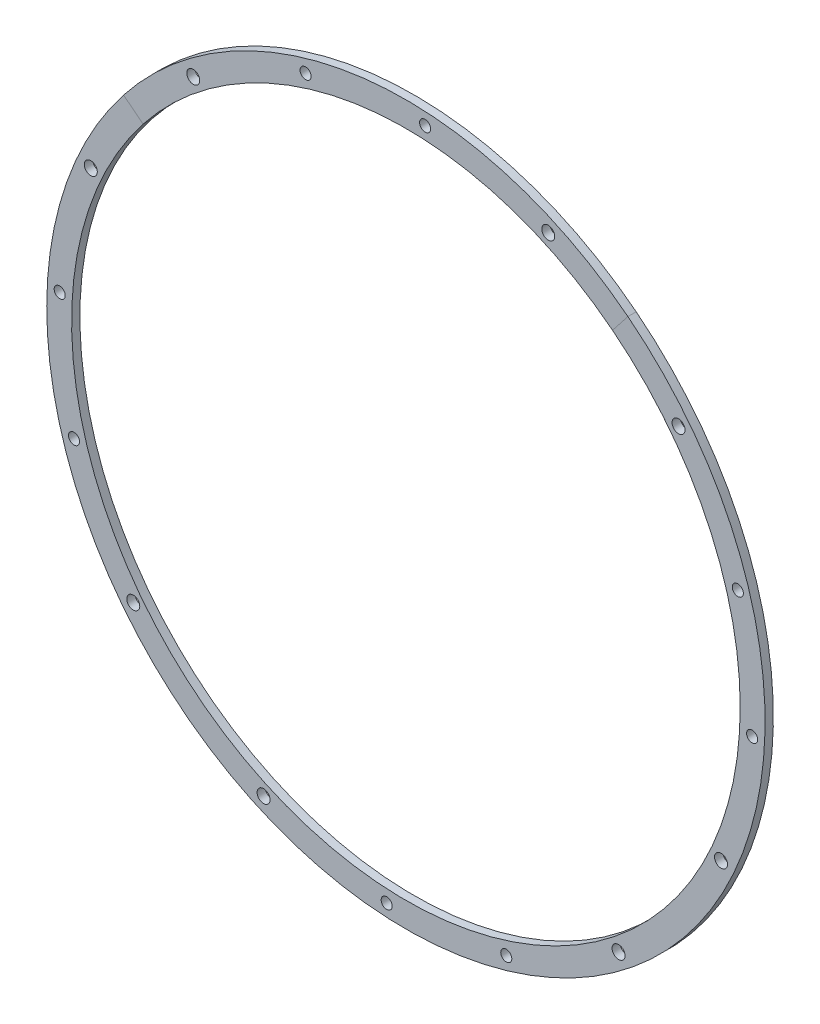
ISO-10303-21;
HEADER;
FILE_DESCRIPTION(('STEP AP214'),'2;1');
FILE_NAME('part.step','',(''),(''),'','','');
FILE_SCHEMA(('AUTOMOTIVE_DESIGN { 1 0 10303 214 1 1 1 1 }'));
ENDSEC;
DATA;
#1=APPLICATION_CONTEXT('core data for automotive mechanical design processes');
#2=APPLICATION_PROTOCOL_DEFINITION('international standard','automotive_design',2000,#1);
#3=PRODUCT_CONTEXT('',#1,'mechanical');
#4=PRODUCT('Part','Part','',(#3));
#5=PRODUCT_RELATED_PRODUCT_CATEGORY('part','',(#4));
#6=PRODUCT_DEFINITION_FORMATION('','',#4);
#7=PRODUCT_DEFINITION_CONTEXT('part definition',#1,'design');
#8=PRODUCT_DEFINITION('design','',#6,#7);
#9=PRODUCT_DEFINITION_SHAPE('','',#8);
#10=(LENGTH_UNIT() NAMED_UNIT(*) SI_UNIT(.MILLI.,.METRE.));
#11=(NAMED_UNIT(*) PLANE_ANGLE_UNIT() SI_UNIT($,.RADIAN.));
#12=(NAMED_UNIT(*) SI_UNIT($,.STERADIAN.) SOLID_ANGLE_UNIT());
#13=UNCERTAINTY_MEASURE_WITH_UNIT(LENGTH_MEASURE(1.E-05),#10,'distance_accuracy_value','');
#14=(GEOMETRIC_REPRESENTATION_CONTEXT(3) GLOBAL_UNCERTAINTY_ASSIGNED_CONTEXT((#13)) GLOBAL_UNIT_ASSIGNED_CONTEXT((#10,
#11,#12)) REPRESENTATION_CONTEXT('',''));
#15=CARTESIAN_POINT('',(0.,0.,0.));
#16=DIRECTION('',(0.,0.,1.));
#17=DIRECTION('',(1.,0.,0.));
#18=AXIS2_PLACEMENT_3D('',#15,#16,#17);
#19=CARTESIAN_POINT('',(-6.95654324842091,-125.307048908004,-7.));
#20=DIRECTION('',(0.,0.,1.));
#21=DIRECTION('',(1.,0.,0.));
#22=AXIS2_PLACEMENT_3D('',#19,#20,#21);
#23=CYLINDRICAL_SURFACE('',#22,2.);
#24=CARTESIAN_POINT('',(-6.95654324842091,-125.307048908004,3.));
#25=DIRECTION('',(0.,0.,1.));
#26=DIRECTION('',(1.,0.,0.));
#27=AXIS2_PLACEMENT_3D('',#24,#25,#26);
#28=CIRCLE('',#27,2.);
#29=CARTESIAN_POINT('',(-4.95654324842091,-125.307048908004,3.));
#30=VERTEX_POINT('',#29);
#31=EDGE_CURVE('E60',#30,#30,#28,.T.);
#32=ORIENTED_EDGE('',*,*,#31,.T.);
#33=EDGE_LOOP('',(#32));
#34=FACE_BOUND('',#33,.T.);
#35=CARTESIAN_POINT('',(-6.95654324842091,-125.307048908004,0.));
#36=DIRECTION('',(0.,0.,1.));
#37=DIRECTION('',(1.,0.,0.));
#38=AXIS2_PLACEMENT_3D('',#35,#36,#37);
#39=CIRCLE('',#38,2.);
#40=CARTESIAN_POINT('',(-4.95654324842091,-125.307048908004,0.));
#41=VERTEX_POINT('',#40);
#42=EDGE_CURVE('E146',#41,#41,#39,.T.);
#43=ORIENTED_EDGE('',*,*,#42,.F.);
#44=EDGE_LOOP('',(#43));
#45=FACE_BOUND('',#44,.T.);
#46=ADVANCED_FACE('F51',(#34,#45),#23,.F.);
#47=CARTESIAN_POINT('',(36.3205224705112,-120.129387110187,-7.));
#48=DIRECTION('',(0.,0.,1.));
#49=DIRECTION('',(1.,0.,0.));
#50=AXIS2_PLACEMENT_3D('',#47,#48,#49);
#51=CYLINDRICAL_SURFACE('',#50,2.);
#52=CARTESIAN_POINT('',(36.3205224705112,-120.129387110187,3.));
#53=DIRECTION('',(0.,0.,1.));
#54=DIRECTION('',(-1.,0.,0.));
#55=AXIS2_PLACEMENT_3D('',#52,#53,#54);
#56=CIRCLE('',#55,2.);
#57=CARTESIAN_POINT('',(34.3205224705112,-120.129387110187,3.));
#58=VERTEX_POINT('',#57);
#59=EDGE_CURVE('E12',#58,#58,#56,.T.);
#60=ORIENTED_EDGE('',*,*,#59,.T.);
#61=EDGE_LOOP('',(#60));
#62=FACE_BOUND('',#61,.T.);
#63=CARTESIAN_POINT('',(36.3205224705112,-120.129387110187,0.));
#64=DIRECTION('',(0.,0.,1.));
#65=DIRECTION('',(1.,0.,0.));
#66=AXIS2_PLACEMENT_3D('',#63,#64,#65);
#67=CIRCLE('',#66,2.);
#68=CARTESIAN_POINT('',(38.3205224705112,-120.129387110187,0.));
#69=VERTEX_POINT('',#68);
#70=EDGE_CURVE('E149',#69,#69,#67,.T.);
#71=ORIENTED_EDGE('',*,*,#70,.F.);
#72=EDGE_LOOP('',(#71));
#73=FACE_BOUND('',#72,.T.);
#74=ADVANCED_FACE('F271',(#62,#73),#51,.F.);
#75=CARTESIAN_POINT('',(76.968539476143,-98.6817811498755,3.));
#76=DIRECTION('',(0.,0.,-1.));
#77=DIRECTION('',(-1.,0.,0.));
#78=AXIS2_PLACEMENT_3D('',#75,#76,#77);
#79=CYLINDRICAL_SURFACE('',#78,2.35000000000002);
#80=CARTESIAN_POINT('',(76.968539476143,-98.6817811498755,3.));
#81=DIRECTION('',(0.,0.,1.));
#82=DIRECTION('',(1.,0.,0.));
#83=AXIS2_PLACEMENT_3D('',#80,#81,#82);
#84=CIRCLE('',#83,2.35000000000002);
#85=CARTESIAN_POINT('',(79.318539476143,-98.6817811498755,3.));
#86=VERTEX_POINT('',#85);
#87=EDGE_CURVE('E157',#86,#86,#84,.T.);
#88=ORIENTED_EDGE('',*,*,#87,.T.);
#89=EDGE_LOOP('',(#88));
#90=FACE_BOUND('',#89,.T.);
#91=CARTESIAN_POINT('',(76.968539476143,-98.6817811498755,0.));
#92=DIRECTION('',(0.,0.,1.));
#93=DIRECTION('',(1.,0.,0.));
#94=AXIS2_PLACEMENT_3D('',#91,#92,#93);
#95=CIRCLE('',#94,2.35000000000002);
#96=CARTESIAN_POINT('',(79.318539476143,-98.6817811498755,0.));
#97=VERTEX_POINT('',#96);
#98=EDGE_CURVE('E153',#97,#97,#95,.T.);
#99=ORIENTED_EDGE('',*,*,#98,.F.);
#100=EDGE_LOOP('',(#99));
#101=FACE_BOUND('',#100,.T.);
#102=ADVANCED_FACE('F231',(#90,#101),#79,.F.);
#103=CARTESIAN_POINT('',(-51.5156422585501,-114.054323033784,3.));
#104=DIRECTION('',(0.,0.,-1.));
#105=DIRECTION('',(-1.,0.,0.));
#106=AXIS2_PLACEMENT_3D('',#103,#104,#105);
#107=CYLINDRICAL_SURFACE('',#106,2.35000000000001);
#108=CARTESIAN_POINT('',(-51.5156422585501,-114.054323033784,3.));
#109=DIRECTION('',(0.,0.,1.));
#110=DIRECTION('',(1.,0.,0.));
#111=AXIS2_PLACEMENT_3D('',#108,#109,#110);
#112=CIRCLE('',#111,2.35000000000001);
#113=CARTESIAN_POINT('',(-49.1656422585501,-114.054323033784,3.));
#114=VERTEX_POINT('',#113);
#115=EDGE_CURVE('E156',#114,#114,#112,.T.);
#116=ORIENTED_EDGE('',*,*,#115,.T.);
#117=EDGE_LOOP('',(#116));
#118=FACE_BOUND('',#117,.T.);
#119=CARTESIAN_POINT('',(-51.5156422585501,-114.054323033784,0.));
#120=DIRECTION('',(0.,0.,1.));
#121=DIRECTION('',(1.,0.,0.));
#122=AXIS2_PLACEMENT_3D('',#119,#120,#121);
#123=CIRCLE('',#122,2.35000000000001);
#124=CARTESIAN_POINT('',(-49.1656422585501,-114.054323033784,0.));
#125=VERTEX_POINT('',#124);
#126=EDGE_CURVE('E150',#125,#125,#123,.T.);
#127=ORIENTED_EDGE('',*,*,#126,.F.);
#128=EDGE_LOOP('',(#127));
#129=FACE_BOUND('',#128,.T.);
#130=ADVANCED_FACE('F225',(#118,#129),#107,.F.);
#131=CARTESIAN_POINT('',(0.,0.,3.));
#132=DIRECTION('',(0.,0.,1.));
#133=DIRECTION('',(1.,0.,0.));
#134=AXIS2_PLACEMENT_3D('',#131,#132,#133);
#135=PLANE('',#134);
#136=ORIENTED_EDGE('',*,*,#115,.F.);
#137=EDGE_LOOP('',(#136));
#138=FACE_BOUND('',#137,.T.);
#139=ORIENTED_EDGE('',*,*,#87,.F.);
#140=EDGE_LOOP('',(#139));
#141=FACE_BOUND('',#140,.T.);
#142=ORIENTED_EDGE('',*,*,#59,.F.);
#143=EDGE_LOOP('',(#142));
#144=FACE_BOUND('',#143,.T.);
#145=ORIENTED_EDGE('',*,*,#31,.F.);
#146=EDGE_LOOP('',(#145));
#147=FACE_BOUND('',#146,.T.);
#148=CARTESIAN_POINT('',(0.,0.,3.));
#149=DIRECTION('',(0.,0.,1.));
#150=DIRECTION('',(1.,0.,0.));
#151=AXIS2_PLACEMENT_3D('',#148,#149,#150);
#152=CIRCLE('',#151,121.);
#153=CARTESIAN_POINT('',(-95.1179707961619,74.7901840592767,3.));
#154=VERTEX_POINT('',#153);
#155=CARTESIAN_POINT('',(74.7901840592768,95.1179707961618,3.));
#156=VERTEX_POINT('',#155);
#157=EDGE_CURVE('E168',#154,#156,#152,.T.);
#158=ORIENTED_EDGE('',*,*,#157,.F.);
#159=DIRECTION('',(0.786098932199685,-0.618100694704767,0.));
#160=VECTOR('',#159,1.);
#161=CARTESIAN_POINT('',(0.,0.,3.));
#162=LINE('',#161,#160);
#163=CARTESIAN_POINT('',(-102.192861185959,80.3530903116197,3.));
#164=VERTEX_POINT('',#163);
#165=EDGE_CURVE('E99',#164,#154,#162,.T.);
#166=ORIENTED_EDGE('',*,*,#165,.F.);
#167=CARTESIAN_POINT('',(0.,0.,3.));
#168=DIRECTION('',(0.,0.,1.));
#169=DIRECTION('',(1.,0.,0.));
#170=AXIS2_PLACEMENT_3D('',#167,#168,#169);
#171=CIRCLE('',#170,130.);
#172=CARTESIAN_POINT('',(80.3530903116197,102.192861185959,3.));
#173=VERTEX_POINT('',#172);
#174=EDGE_CURVE('E55',#164,#173,#171,.T.);
#175=ORIENTED_EDGE('',*,*,#174,.T.);
#176=DIRECTION('',(-0.618100694704767,-0.786098932199685,0.));
#177=VECTOR('',#176,1.);
#178=CARTESIAN_POINT('',(0.,0.,3.));
#179=LINE('',#178,#177);
#180=EDGE_CURVE('E97',#173,#156,#179,.T.);
#181=ORIENTED_EDGE('',*,*,#180,.T.);
#182=EDGE_LOOP('',(#158,#166,#175,#181));
#183=FACE_BOUND('',#182,.T.);
#184=CARTESIAN_POINT('',(-125.307048908004,6.9565432484209,3.));
#185=DIRECTION('',(0.,0.,1.));
#186=DIRECTION('',(1.,0.,0.));
#187=AXIS2_PLACEMENT_3D('',#184,#185,#186);
#188=CIRCLE('',#187,2.);
#189=CARTESIAN_POINT('',(-123.307048908004,6.9565432484209,3.));
#190=VERTEX_POINT('',#189);
#191=EDGE_CURVE('E121',#190,#190,#188,.T.);
#192=ORIENTED_EDGE('',*,*,#191,.F.);
#193=EDGE_LOOP('',(#192));
#194=FACE_BOUND('',#193,.T.);
#195=CARTESIAN_POINT('',(-120.129387110187,-36.3205224705112,3.));
#196=DIRECTION('',(0.,0.,1.));
#197=DIRECTION('',(-1.,0.,0.));
#198=AXIS2_PLACEMENT_3D('',#195,#196,#197);
#199=CIRCLE('',#198,2.);
#200=CARTESIAN_POINT('',(-122.129387110187,-36.3205224705112,3.));
#201=VERTEX_POINT('',#200);
#202=EDGE_CURVE('E100',#201,#201,#199,.T.);
#203=ORIENTED_EDGE('',*,*,#202,.F.);
#204=EDGE_LOOP('',(#203));
#205=FACE_BOUND('',#204,.T.);
#206=CARTESIAN_POINT('',(-98.6817811498755,-76.968539476143,3.));
#207=DIRECTION('',(0.,0.,1.));
#208=DIRECTION('',(1.,0.,0.));
#209=AXIS2_PLACEMENT_3D('',#206,#207,#208);
#210=CIRCLE('',#209,2.35);
#211=CARTESIAN_POINT('',(-96.3317811498755,-76.968539476143,3.));
#212=VERTEX_POINT('',#211);
#213=EDGE_CURVE('E126',#212,#212,#210,.T.);
#214=ORIENTED_EDGE('',*,*,#213,.F.);
#215=EDGE_LOOP('',(#214));
#216=FACE_BOUND('',#215,.T.);
#217=CARTESIAN_POINT('',(-114.054323033784,51.5156422585501,3.));
#218=DIRECTION('',(0.,0.,1.));
#219=DIRECTION('',(1.,0.,0.));
#220=AXIS2_PLACEMENT_3D('',#217,#218,#219);
#221=CIRCLE('',#220,2.35);
#222=CARTESIAN_POINT('',(-111.704323033784,51.5156422585501,3.));
#223=VERTEX_POINT('',#222);
#224=EDGE_CURVE('E125',#223,#223,#221,.T.);
#225=ORIENTED_EDGE('',*,*,#224,.F.);
#226=EDGE_LOOP('',(#225));
#227=FACE_BOUND('',#226,.T.);
#228=CARTESIAN_POINT('',(114.054323033784,-51.5156422585501,3.));
#229=DIRECTION('',(0.,0.,1.));
#230=DIRECTION('',(1.,0.,0.));
#231=AXIS2_PLACEMENT_3D('',#228,#229,#230);
#232=CIRCLE('',#231,2.35000000000002);
#233=CARTESIAN_POINT('',(116.404323033784,-51.5156422585501,3.));
#234=VERTEX_POINT('',#233);
#235=EDGE_CURVE('E211',#234,#234,#232,.T.);
#236=ORIENTED_EDGE('',*,*,#235,.F.);
#237=EDGE_LOOP('',(#236));
#238=FACE_BOUND('',#237,.T.);
#239=CARTESIAN_POINT('',(98.6817811498755,76.968539476143,3.));
#240=DIRECTION('',(0.,0.,1.));
#241=DIRECTION('',(1.,0.,0.));
#242=AXIS2_PLACEMENT_3D('',#239,#240,#241);
#243=CIRCLE('',#242,2.35000000000002);
#244=CARTESIAN_POINT('',(101.031781149876,76.968539476143,3.));
#245=VERTEX_POINT('',#244);
#246=EDGE_CURVE('E207',#245,#245,#243,.T.);
#247=ORIENTED_EDGE('',*,*,#246,.F.);
#248=EDGE_LOOP('',(#247));
#249=FACE_BOUND('',#248,.T.);
#250=CARTESIAN_POINT('',(125.307048908004,-6.95654324842089,3.));
#251=DIRECTION('',(0.,0.,1.));
#252=DIRECTION('',(1.,0.,0.));
#253=AXIS2_PLACEMENT_3D('',#250,#251,#252);
#254=CIRCLE('',#253,2.);
#255=CARTESIAN_POINT('',(127.307048908004,-6.95654324842089,3.));
#256=VERTEX_POINT('',#255);
#257=EDGE_CURVE('E205',#256,#256,#254,.T.);
#258=ORIENTED_EDGE('',*,*,#257,.F.);
#259=EDGE_LOOP('',(#258));
#260=FACE_BOUND('',#259,.T.);
#261=CARTESIAN_POINT('',(120.129387110187,36.3205224705112,3.));
#262=DIRECTION('',(0.,0.,1.));
#263=DIRECTION('',(-1.,0.,0.));
#264=AXIS2_PLACEMENT_3D('',#261,#262,#263);
#265=CIRCLE('',#264,2.);
#266=CARTESIAN_POINT('',(118.129387110187,36.3205224705112,3.));
#267=VERTEX_POINT('',#266);
#268=EDGE_CURVE('E145',#267,#267,#265,.T.);
#269=ORIENTED_EDGE('',*,*,#268,.F.);
#270=EDGE_LOOP('',(#269));
#271=FACE_BOUND('',#270,.T.);
#272=ADVANCED_FACE('F95',(#138,#141,#144,#147,#183,#194,#205,#216,#227,#238,#249,#260,#271),
#135,.T.);
#273=CARTESIAN_POINT('',(0.,0.,0.));
#274=DIRECTION('',(0.,0.,1.));
#275=DIRECTION('',(1.,0.,0.));
#276=AXIS2_PLACEMENT_3D('',#273,#274,#275);
#277=PLANE('',#276);
#278=ORIENTED_EDGE('',*,*,#126,.T.);
#279=EDGE_LOOP('',(#278));
#280=FACE_BOUND('',#279,.T.);
#281=ORIENTED_EDGE('',*,*,#98,.T.);
#282=EDGE_LOOP('',(#281));
#283=FACE_BOUND('',#282,.T.);
#284=ORIENTED_EDGE('',*,*,#70,.T.);
#285=EDGE_LOOP('',(#284));
#286=FACE_BOUND('',#285,.T.);
#287=ORIENTED_EDGE('',*,*,#42,.T.);
#288=EDGE_LOOP('',(#287));
#289=FACE_BOUND('',#288,.T.);
#290=CARTESIAN_POINT('',(0.,0.,0.));
#291=DIRECTION('',(0.,0.,1.));
#292=DIRECTION('',(1.,0.,0.));
#293=AXIS2_PLACEMENT_3D('',#290,#291,#292);
#294=CIRCLE('',#293,130.);
#295=CARTESIAN_POINT('',(-102.192861185959,80.3530903116197,0.));
#296=VERTEX_POINT('',#295);
#297=CARTESIAN_POINT('',(80.3530903116197,102.192861185959,0.));
#298=VERTEX_POINT('',#297);
#299=EDGE_CURVE('E75',#296,#298,#294,.T.);
#300=ORIENTED_EDGE('',*,*,#299,.F.);
#301=DIRECTION('',(0.786098932199685,-0.618100694704767,0.));
#302=VECTOR('',#301,1.);
#303=CARTESIAN_POINT('',(0.,0.,0.));
#304=LINE('',#303,#302);
#305=CARTESIAN_POINT('',(-95.1179707961619,74.7901840592767,0.));
#306=VERTEX_POINT('',#305);
#307=EDGE_CURVE('E139',#296,#306,#304,.T.);
#308=ORIENTED_EDGE('',*,*,#307,.T.);
#309=CARTESIAN_POINT('',(0.,0.,0.));
#310=DIRECTION('',(0.,0.,1.));
#311=DIRECTION('',(1.,0.,0.));
#312=AXIS2_PLACEMENT_3D('',#309,#310,#311);
#313=CIRCLE('',#312,121.);
#314=CARTESIAN_POINT('',(74.7901840592768,95.1179707961618,0.));
#315=VERTEX_POINT('',#314);
#316=EDGE_CURVE('E160',#306,#315,#313,.T.);
#317=ORIENTED_EDGE('',*,*,#316,.T.);
#318=DIRECTION('',(-0.618100694704767,-0.786098932199685,0.));
#319=VECTOR('',#318,1.);
#320=CARTESIAN_POINT('',(0.,0.,0.));
#321=LINE('',#320,#319);
#322=EDGE_CURVE('E109',#298,#315,#321,.T.);
#323=ORIENTED_EDGE('',*,*,#322,.F.);
#324=EDGE_LOOP('',(#300,#308,#317,#323));
#325=FACE_BOUND('',#324,.T.);
#326=CARTESIAN_POINT('',(-125.307048908004,6.9565432484209,0.));
#327=DIRECTION('',(0.,0.,1.));
#328=DIRECTION('',(1.,0.,0.));
#329=AXIS2_PLACEMENT_3D('',#326,#327,#328);
#330=CIRCLE('',#329,2.);
#331=CARTESIAN_POINT('',(-123.307048908004,6.9565432484209,0.));
#332=VERTEX_POINT('',#331);
#333=EDGE_CURVE('E114',#332,#332,#330,.T.);
#334=ORIENTED_EDGE('',*,*,#333,.T.);
#335=EDGE_LOOP('',(#334));
#336=FACE_BOUND('',#335,.T.);
#337=CARTESIAN_POINT('',(-120.129387110187,-36.3205224705112,0.));
#338=DIRECTION('',(0.,0.,1.));
#339=DIRECTION('',(1.,0.,0.));
#340=AXIS2_PLACEMENT_3D('',#337,#338,#339);
#341=CIRCLE('',#340,2.);
#342=CARTESIAN_POINT('',(-118.129387110187,-36.3205224705112,0.));
#343=VERTEX_POINT('',#342);
#344=EDGE_CURVE('E117',#343,#343,#341,.T.);
#345=ORIENTED_EDGE('',*,*,#344,.T.);
#346=EDGE_LOOP('',(#345));
#347=FACE_BOUND('',#346,.T.);
#348=CARTESIAN_POINT('',(-98.6817811498755,-76.968539476143,0.));
#349=DIRECTION('',(0.,0.,1.));
#350=DIRECTION('',(1.,0.,0.));
#351=AXIS2_PLACEMENT_3D('',#348,#349,#350);
#352=CIRCLE('',#351,2.35);
#353=CARTESIAN_POINT('',(-96.3317811498755,-76.968539476143,0.));
#354=VERTEX_POINT('',#353);
#355=EDGE_CURVE('E122',#354,#354,#352,.T.);
#356=ORIENTED_EDGE('',*,*,#355,.T.);
#357=EDGE_LOOP('',(#356));
#358=FACE_BOUND('',#357,.T.);
#359=CARTESIAN_POINT('',(-114.054323033784,51.5156422585501,0.));
#360=DIRECTION('',(0.,0.,1.));
#361=DIRECTION('',(1.,0.,0.));
#362=AXIS2_PLACEMENT_3D('',#359,#360,#361);
#363=CIRCLE('',#362,2.35);
#364=CARTESIAN_POINT('',(-111.704323033784,51.5156422585501,0.));
#365=VERTEX_POINT('',#364);
#366=EDGE_CURVE('E118',#365,#365,#363,.T.);
#367=ORIENTED_EDGE('',*,*,#366,.T.);
#368=EDGE_LOOP('',(#367));
#369=FACE_BOUND('',#368,.T.);
#370=CARTESIAN_POINT('',(98.6817811498755,76.968539476143,0.));
#371=DIRECTION('',(0.,0.,1.));
#372=DIRECTION('',(1.,0.,0.));
#373=AXIS2_PLACEMENT_3D('',#370,#371,#372);
#374=CIRCLE('',#373,2.35000000000002);
#375=CARTESIAN_POINT('',(101.031781149876,76.968539476143,0.));
#376=VERTEX_POINT('',#375);
#377=EDGE_CURVE('E191',#376,#376,#374,.T.);
#378=ORIENTED_EDGE('',*,*,#377,.T.);
#379=EDGE_LOOP('',(#378));
#380=FACE_BOUND('',#379,.T.);
#381=CARTESIAN_POINT('',(114.054323033784,-51.5156422585501,0.));
#382=DIRECTION('',(0.,0.,1.));
#383=DIRECTION('',(1.,0.,0.));
#384=AXIS2_PLACEMENT_3D('',#381,#382,#383);
#385=CIRCLE('',#384,2.35000000000002);
#386=CARTESIAN_POINT('',(116.404323033784,-51.5156422585501,0.));
#387=VERTEX_POINT('',#386);
#388=EDGE_CURVE('E195',#387,#387,#385,.T.);
#389=ORIENTED_EDGE('',*,*,#388,.T.);
#390=EDGE_LOOP('',(#389));
#391=FACE_BOUND('',#390,.T.);
#392=CARTESIAN_POINT('',(125.307048908004,-6.95654324842089,0.));
#393=DIRECTION('',(0.,0.,1.));
#394=DIRECTION('',(1.,0.,0.));
#395=AXIS2_PLACEMENT_3D('',#392,#393,#394);
#396=CIRCLE('',#395,2.);
#397=CARTESIAN_POINT('',(127.307048908004,-6.95654324842089,0.));
#398=VERTEX_POINT('',#397);
#399=EDGE_CURVE('E199',#398,#398,#396,.T.);
#400=ORIENTED_EDGE('',*,*,#399,.T.);
#401=EDGE_LOOP('',(#400));
#402=FACE_BOUND('',#401,.T.);
#403=CARTESIAN_POINT('',(120.129387110187,36.3205224705112,0.));
#404=DIRECTION('',(0.,0.,1.));
#405=DIRECTION('',(1.,0.,0.));
#406=AXIS2_PLACEMENT_3D('',#403,#404,#405);
#407=CIRCLE('',#406,2.);
#408=CARTESIAN_POINT('',(122.129387110187,36.3205224705112,0.));
#409=VERTEX_POINT('',#408);
#410=EDGE_CURVE('E202',#409,#409,#407,.T.);
#411=ORIENTED_EDGE('',*,*,#410,.T.);
#412=EDGE_LOOP('',(#411));
#413=FACE_BOUND('',#412,.T.);
#414=ADVANCED_FACE('F175',(#280,#283,#286,#289,#325,#336,#347,#358,#369,#380,#391,#402,#413),
#277,.F.);
#415=CARTESIAN_POINT('',(0.,0.,3.));
#416=DIRECTION('',(0.,0.,-1.));
#417=DIRECTION('',(-1.,0.,0.));
#418=AXIS2_PLACEMENT_3D('',#415,#416,#417);
#419=CYLINDRICAL_SURFACE('',#418,121.);
#420=ORIENTED_EDGE('',*,*,#316,.F.);
#421=DIRECTION('',(0.,0.,-1.));
#422=VECTOR('',#421,1.);
#423=CARTESIAN_POINT('',(-95.1179707961619,74.7901840592767,3.));
#424=LINE('',#423,#422);
#425=EDGE_CURVE('E142',#154,#306,#424,.T.);
#426=ORIENTED_EDGE('',*,*,#425,.F.);
#427=ORIENTED_EDGE('',*,*,#157,.T.);
#428=DIRECTION('',(0.,0.,-1.));
#429=VECTOR('',#428,1.);
#430=CARTESIAN_POINT('',(74.7901840592768,95.1179707961619,3.));
#431=LINE('',#430,#429);
#432=EDGE_CURVE('E108',#156,#315,#431,.T.);
#433=ORIENTED_EDGE('',*,*,#432,.T.);
#434=EDGE_LOOP('',(#420,#426,#427,#433));
#435=FACE_BOUND('',#434,.T.);
#436=ADVANCED_FACE('F171',(#435),#419,.F.);
#437=CARTESIAN_POINT('',(0.,0.,3.));
#438=DIRECTION('',(0.,0.,-1.));
#439=DIRECTION('',(-1.,0.,0.));
#440=AXIS2_PLACEMENT_3D('',#437,#438,#439);
#441=CYLINDRICAL_SURFACE('',#440,130.);
#442=ORIENTED_EDGE('',*,*,#174,.F.);
#443=DIRECTION('',(0.,0.,-1.));
#444=VECTOR('',#443,1.);
#445=CARTESIAN_POINT('',(-102.192861185959,80.3530903116197,3.));
#446=LINE('',#445,#444);
#447=EDGE_CURVE('E129',#164,#296,#446,.T.);
#448=ORIENTED_EDGE('',*,*,#447,.T.);
#449=ORIENTED_EDGE('',*,*,#299,.T.);
#450=DIRECTION('',(0.,0.,-1.));
#451=VECTOR('',#450,1.);
#452=CARTESIAN_POINT('',(80.3530903116197,102.192861185959,3.));
#453=LINE('',#452,#451);
#454=EDGE_CURVE('E106',#173,#298,#453,.T.);
#455=ORIENTED_EDGE('',*,*,#454,.F.);
#456=EDGE_LOOP('',(#442,#448,#449,#455));
#457=FACE_BOUND('',#456,.T.);
#458=ADVANCED_FACE('F53',(#457),#441,.T.);
#459=CARTESIAN_POINT('',(-126.825337469734,99.7213276665491,-0.01));
#460=DIRECTION('',(-0.618100694704767,-0.786098932199685,0.));
#461=DIRECTION('',(0.786098932199685,-0.618100694704767,0.));
#462=AXIS2_PLACEMENT_3D('',#459,#460,#461);
#463=PLANE('',#462);
#464=ORIENTED_EDGE('',*,*,#165,.T.);
#465=ORIENTED_EDGE('',*,*,#425,.T.);
#466=ORIENTED_EDGE('',*,*,#307,.F.);
#467=ORIENTED_EDGE('',*,*,#447,.F.);
#468=EDGE_LOOP('',(#464,#465,#466,#467));
#469=FACE_BOUND('',#468,.T.);
#470=ADVANCED_FACE('F174',(#469),#463,.F.);
#471=CARTESIAN_POINT('',(-98.6817811498755,-76.968539476143,3.));
#472=DIRECTION('',(0.,0.,-1.));
#473=DIRECTION('',(-1.,0.,0.));
#474=AXIS2_PLACEMENT_3D('',#471,#472,#473);
#475=CYLINDRICAL_SURFACE('',#474,2.35);
#476=ORIENTED_EDGE('',*,*,#213,.T.);
#477=EDGE_LOOP('',(#476));
#478=FACE_BOUND('',#477,.T.);
#479=ORIENTED_EDGE('',*,*,#355,.F.);
#480=EDGE_LOOP('',(#479));
#481=FACE_BOUND('',#480,.T.);
#482=ADVANCED_FACE('F242',(#478,#481),#475,.F.);
#483=CARTESIAN_POINT('',(-114.054323033784,51.5156422585501,3.));
#484=DIRECTION('',(0.,0.,-1.));
#485=DIRECTION('',(-1.,0.,0.));
#486=AXIS2_PLACEMENT_3D('',#483,#484,#485);
#487=CYLINDRICAL_SURFACE('',#486,2.35);
#488=ORIENTED_EDGE('',*,*,#224,.T.);
#489=EDGE_LOOP('',(#488));
#490=FACE_BOUND('',#489,.T.);
#491=ORIENTED_EDGE('',*,*,#366,.F.);
#492=EDGE_LOOP('',(#491));
#493=FACE_BOUND('',#492,.T.);
#494=ADVANCED_FACE('F301',(#490,#493),#487,.F.);
#495=CARTESIAN_POINT('',(-120.129387110187,-36.3205224705112,-7.));
#496=DIRECTION('',(0.,0.,1.));
#497=DIRECTION('',(1.,0.,0.));
#498=AXIS2_PLACEMENT_3D('',#495,#496,#497);
#499=CYLINDRICAL_SURFACE('',#498,2.);
#500=ORIENTED_EDGE('',*,*,#202,.T.);
#501=EDGE_LOOP('',(#500));
#502=FACE_BOUND('',#501,.T.);
#503=ORIENTED_EDGE('',*,*,#344,.F.);
#504=EDGE_LOOP('',(#503));
#505=FACE_BOUND('',#504,.T.);
#506=ADVANCED_FACE('F297',(#502,#505),#499,.F.);
#507=CARTESIAN_POINT('',(-125.307048908004,6.9565432484209,-7.));
#508=DIRECTION('',(0.,0.,1.));
#509=DIRECTION('',(1.,0.,0.));
#510=AXIS2_PLACEMENT_3D('',#507,#508,#509);
#511=CYLINDRICAL_SURFACE('',#510,2.);
#512=ORIENTED_EDGE('',*,*,#191,.T.);
#513=EDGE_LOOP('',(#512));
#514=FACE_BOUND('',#513,.T.);
#515=ORIENTED_EDGE('',*,*,#333,.F.);
#516=EDGE_LOOP('',(#515));
#517=FACE_BOUND('',#516,.T.);
#518=ADVANCED_FACE('F244',(#514,#517),#511,.F.);
#519=CARTESIAN_POINT('',(104.190001620744,132.508585933674,-0.01));
#520=DIRECTION('',(-0.786098932199685,0.618100694704767,0.));
#521=DIRECTION('',(-0.618100694704767,-0.786098932199685,0.));
#522=AXIS2_PLACEMENT_3D('',#519,#520,#521);
#523=PLANE('',#522);
#524=ORIENTED_EDGE('',*,*,#180,.F.);
#525=ORIENTED_EDGE('',*,*,#454,.T.);
#526=ORIENTED_EDGE('',*,*,#322,.T.);
#527=ORIENTED_EDGE('',*,*,#432,.F.);
#528=EDGE_LOOP('',(#524,#525,#526,#527));
#529=FACE_BOUND('',#528,.T.);
#530=ADVANCED_FACE('F104',(#529),#523,.T.);
#531=CARTESIAN_POINT('',(120.129387110187,36.3205224705112,-7.));
#532=DIRECTION('',(0.,0.,1.));
#533=DIRECTION('',(1.,0.,0.));
#534=AXIS2_PLACEMENT_3D('',#531,#532,#533);
#535=CYLINDRICAL_SURFACE('',#534,2.);
#536=ORIENTED_EDGE('',*,*,#268,.T.);
#537=EDGE_LOOP('',(#536));
#538=FACE_BOUND('',#537,.T.);
#539=ORIENTED_EDGE('',*,*,#410,.F.);
#540=EDGE_LOOP('',(#539));
#541=FACE_BOUND('',#540,.T.);
#542=ADVANCED_FACE('F222',(#538,#541),#535,.F.);
#543=CARTESIAN_POINT('',(125.307048908004,-6.95654324842089,-7.));
#544=DIRECTION('',(0.,0.,1.));
#545=DIRECTION('',(1.,0.,0.));
#546=AXIS2_PLACEMENT_3D('',#543,#544,#545);
#547=CYLINDRICAL_SURFACE('',#546,2.);
#548=ORIENTED_EDGE('',*,*,#257,.T.);
#549=EDGE_LOOP('',(#548));
#550=FACE_BOUND('',#549,.T.);
#551=ORIENTED_EDGE('',*,*,#399,.F.);
#552=EDGE_LOOP('',(#551));
#553=FACE_BOUND('',#552,.T.);
#554=ADVANCED_FACE('F314',(#550,#553),#547,.F.);
#555=CARTESIAN_POINT('',(114.054323033784,-51.5156422585501,3.));
#556=DIRECTION('',(0.,0.,-1.));
#557=DIRECTION('',(-1.,0.,0.));
#558=AXIS2_PLACEMENT_3D('',#555,#556,#557);
#559=CYLINDRICAL_SURFACE('',#558,2.35000000000002);
#560=ORIENTED_EDGE('',*,*,#235,.T.);
#561=EDGE_LOOP('',(#560));
#562=FACE_BOUND('',#561,.T.);
#563=ORIENTED_EDGE('',*,*,#388,.F.);
#564=EDGE_LOOP('',(#563));
#565=FACE_BOUND('',#564,.T.);
#566=ADVANCED_FACE('F317',(#562,#565),#559,.F.);
#567=CARTESIAN_POINT('',(98.6817811498755,76.968539476143,3.));
#568=DIRECTION('',(0.,0.,-1.));
#569=DIRECTION('',(-1.,0.,0.));
#570=AXIS2_PLACEMENT_3D('',#567,#568,#569);
#571=CYLINDRICAL_SURFACE('',#570,2.35000000000002);
#572=ORIENTED_EDGE('',*,*,#246,.T.);
#573=EDGE_LOOP('',(#572));
#574=FACE_BOUND('',#573,.T.);
#575=ORIENTED_EDGE('',*,*,#377,.F.);
#576=EDGE_LOOP('',(#575));
#577=FACE_BOUND('',#576,.T.);
#578=ADVANCED_FACE('F311',(#574,#577),#571,.F.);
#579=CLOSED_SHELL('',(#46,#74,#102,#130,#272,#414,#436,#458,#470,#482,#494,#506,#518,#530,#542,
#554,#566,#578));
#580=MANIFOLD_SOLID_BREP('B2',#579);
#581=CARTESIAN_POINT('',(104.190001620744,132.508585933674,-0.01));
#582=DIRECTION('',(-0.786098932199685,0.618100694704767,0.));
#583=DIRECTION('',(-0.618100694704767,-0.786098932199685,0.));
#584=AXIS2_PLACEMENT_3D('',#581,#582,#583);
#585=PLANE('',#584);
#586=DIRECTION('',(-0.618100694704767,-0.786098932199685,0.));
#587=VECTOR('',#586,1.);
#588=CARTESIAN_POINT('',(0.,0.,3.));
#589=LINE('',#588,#587);
#590=CARTESIAN_POINT('',(80.3530903116197,102.192861185959,3.));
#591=VERTEX_POINT('',#590);
#592=CARTESIAN_POINT('',(74.7901840592768,95.1179707961618,3.));
#593=VERTEX_POINT('',#592);
#594=EDGE_CURVE('E482',#591,#593,#589,.T.);
#595=ORIENTED_EDGE('',*,*,#594,.T.);
#596=DIRECTION('',(0.,0.,-1.));
#597=VECTOR('',#596,1.);
#598=CARTESIAN_POINT('',(74.7901840592768,95.1179707961619,3.));
#599=LINE('',#598,#597);
#600=CARTESIAN_POINT('',(74.7901840592768,95.1179707961618,0.));
#601=VERTEX_POINT('',#600);
#602=EDGE_CURVE('E49',#593,#601,#599,.T.);
#603=ORIENTED_EDGE('',*,*,#602,.T.);
#604=DIRECTION('',(-0.618100694704767,-0.786098932199685,0.));
#605=VECTOR('',#604,1.);
#606=CARTESIAN_POINT('',(0.,0.,0.));
#607=LINE('',#606,#605);
#608=CARTESIAN_POINT('',(80.3530903116197,102.192861185959,0.));
#609=VERTEX_POINT('',#608);
#610=EDGE_CURVE('E445',#609,#601,#607,.T.);
#611=ORIENTED_EDGE('',*,*,#610,.F.);
#612=DIRECTION('',(0.,0.,-1.));
#613=VECTOR('',#612,1.);
#614=CARTESIAN_POINT('',(80.3530903116197,102.192861185959,3.));
#615=LINE('',#614,#613);
#616=EDGE_CURVE('E473',#591,#609,#615,.T.);
#617=ORIENTED_EDGE('',*,*,#616,.F.);
#618=EDGE_LOOP('',(#595,#603,#611,#617));
#619=FACE_BOUND('',#618,.T.);
#620=ADVANCED_FACE('F423',(#619),#585,.F.);
#621=CARTESIAN_POINT('',(-126.825337469734,99.7213276665491,-0.01));
#622=DIRECTION('',(-0.618100694704767,-0.786098932199685,0.));
#623=DIRECTION('',(0.786098932199685,-0.618100694704767,0.));
#624=AXIS2_PLACEMENT_3D('',#621,#622,#623);
#625=PLANE('',#624);
#626=DIRECTION('',(0.786098932199685,-0.618100694704767,0.));
#627=VECTOR('',#626,1.);
#628=CARTESIAN_POINT('',(0.,0.,3.));
#629=LINE('',#628,#627);
#630=CARTESIAN_POINT('',(-102.192861185959,80.3530903116197,3.));
#631=VERTEX_POINT('',#630);
#632=CARTESIAN_POINT('',(-95.1179707961619,74.7901840592767,3.));
#633=VERTEX_POINT('',#632);
#634=EDGE_CURVE('E469',#631,#633,#629,.T.);
#635=ORIENTED_EDGE('',*,*,#634,.F.);
#636=DIRECTION('',(0.,0.,-1.));
#637=VECTOR('',#636,1.);
#638=CARTESIAN_POINT('',(-102.192861185959,80.3530903116197,3.));
#639=LINE('',#638,#637);
#640=CARTESIAN_POINT('',(-102.192861185959,80.3530903116197,0.));
#641=VERTEX_POINT('',#640);
#642=EDGE_CURVE('E427',#631,#641,#639,.T.);
#643=ORIENTED_EDGE('',*,*,#642,.T.);
#644=DIRECTION('',(0.786098932199685,-0.618100694704767,0.));
#645=VECTOR('',#644,1.);
#646=CARTESIAN_POINT('',(0.,0.,0.));
#647=LINE('',#646,#645);
#648=CARTESIAN_POINT('',(-95.1179707961619,74.7901840592767,0.));
#649=VERTEX_POINT('',#648);
#650=EDGE_CURVE('E472',#641,#649,#647,.T.);
#651=ORIENTED_EDGE('',*,*,#650,.T.);
#652=DIRECTION('',(0.,0.,-1.));
#653=VECTOR('',#652,1.);
#654=CARTESIAN_POINT('',(-95.1179707961619,74.7901840592767,3.));
#655=LINE('',#654,#653);
#656=EDGE_CURVE('E466',#633,#649,#655,.T.);
#657=ORIENTED_EDGE('',*,*,#656,.F.);
#658=EDGE_LOOP('',(#635,#643,#651,#657));
#659=FACE_BOUND('',#658,.T.);
#660=ADVANCED_FACE('F425',(#659),#625,.T.);
#661=CARTESIAN_POINT('',(6.95654324842089,125.307048908004,-7.));
#662=DIRECTION('',(0.,0.,1.));
#663=DIRECTION('',(1.,0.,0.));
#664=AXIS2_PLACEMENT_3D('',#661,#662,#663);
#665=CYLINDRICAL_SURFACE('',#664,2.);
#666=CARTESIAN_POINT('',(6.95654324842089,125.307048908004,3.));
#667=DIRECTION('',(0.,0.,1.));
#668=DIRECTION('',(1.,0.,0.));
#669=AXIS2_PLACEMENT_3D('',#666,#667,#668);
#670=CIRCLE('',#669,2.);
#671=CARTESIAN_POINT('',(8.95654324842089,125.307048908004,3.));
#672=VERTEX_POINT('',#671);
#673=EDGE_CURVE('E500',#672,#672,#670,.T.);
#674=ORIENTED_EDGE('',*,*,#673,.T.);
#675=EDGE_LOOP('',(#674));
#676=FACE_BOUND('',#675,.T.);
#677=CARTESIAN_POINT('',(6.95654324842089,125.307048908004,0.));
#678=DIRECTION('',(0.,0.,1.));
#679=DIRECTION('',(1.,0.,0.));
#680=AXIS2_PLACEMENT_3D('',#677,#678,#679);
#681=CIRCLE('',#680,2.);
#682=CARTESIAN_POINT('',(8.95654324842089,125.307048908004,0.));
#683=VERTEX_POINT('',#682);
#684=EDGE_CURVE('E499',#683,#683,#681,.T.);
#685=ORIENTED_EDGE('',*,*,#684,.F.);
#686=EDGE_LOOP('',(#685));
#687=FACE_BOUND('',#686,.T.);
#688=ADVANCED_FACE('F531',(#676,#687),#665,.F.);
#689=CARTESIAN_POINT('',(-36.3205224705112,120.129387110187,-7.));
#690=DIRECTION('',(0.,0.,1.));
#691=DIRECTION('',(1.,0.,0.));
#692=AXIS2_PLACEMENT_3D('',#689,#690,#691);
#693=CYLINDRICAL_SURFACE('',#692,2.);
#694=CARTESIAN_POINT('',(-36.3205224705112,120.129387110187,3.));
#695=DIRECTION('',(0.,0.,1.));
#696=DIRECTION('',(-1.,0.,0.));
#697=AXIS2_PLACEMENT_3D('',#694,#695,#696);
#698=CIRCLE('',#697,2.);
#699=CARTESIAN_POINT('',(-38.3205224705112,120.129387110187,3.));
#700=VERTEX_POINT('',#699);
#701=EDGE_CURVE('E554',#700,#700,#698,.T.);
#702=ORIENTED_EDGE('',*,*,#701,.T.);
#703=EDGE_LOOP('',(#702));
#704=FACE_BOUND('',#703,.T.);
#705=CARTESIAN_POINT('',(-36.3205224705112,120.129387110187,0.));
#706=DIRECTION('',(0.,0.,1.));
#707=DIRECTION('',(1.,0.,0.));
#708=AXIS2_PLACEMENT_3D('',#705,#706,#707);
#709=CIRCLE('',#708,2.);
#710=CARTESIAN_POINT('',(-34.3205224705112,120.129387110187,0.));
#711=VERTEX_POINT('',#710);
#712=EDGE_CURVE('E496',#711,#711,#709,.T.);
#713=ORIENTED_EDGE('',*,*,#712,.F.);
#714=EDGE_LOOP('',(#713));
#715=FACE_BOUND('',#714,.T.);
#716=ADVANCED_FACE('F541',(#704,#715),#693,.F.);
#717=CARTESIAN_POINT('',(-76.968539476143,98.6817811498755,3.));
#718=DIRECTION('',(0.,0.,-1.));
#719=DIRECTION('',(-1.,0.,0.));
#720=AXIS2_PLACEMENT_3D('',#717,#718,#719);
#721=CYLINDRICAL_SURFACE('',#720,2.35);
#722=CARTESIAN_POINT('',(-76.968539476143,98.6817811498755,3.));
#723=DIRECTION('',(0.,0.,1.));
#724=DIRECTION('',(1.,0.,0.));
#725=AXIS2_PLACEMENT_3D('',#722,#723,#724);
#726=CIRCLE('',#725,2.35);
#727=CARTESIAN_POINT('',(-74.618539476143,98.6817811498755,3.));
#728=VERTEX_POINT('',#727);
#729=EDGE_CURVE('E489',#728,#728,#726,.T.);
#730=ORIENTED_EDGE('',*,*,#729,.T.);
#731=EDGE_LOOP('',(#730));
#732=FACE_BOUND('',#731,.T.);
#733=CARTESIAN_POINT('',(-76.968539476143,98.6817811498755,0.));
#734=DIRECTION('',(0.,0.,1.));
#735=DIRECTION('',(1.,0.,0.));
#736=AXIS2_PLACEMENT_3D('',#733,#734,#735);
#737=CIRCLE('',#736,2.35);
#738=CARTESIAN_POINT('',(-74.618539476143,98.6817811498755,0.));
#739=VERTEX_POINT('',#738);
#740=EDGE_CURVE('E492',#739,#739,#737,.T.);
#741=ORIENTED_EDGE('',*,*,#740,.F.);
#742=EDGE_LOOP('',(#741));
#743=FACE_BOUND('',#742,.T.);
#744=ADVANCED_FACE('F520',(#732,#743),#721,.F.);
#745=CARTESIAN_POINT('',(51.5156422585501,114.054323033784,3.));
#746=DIRECTION('',(0.,0.,-1.));
#747=DIRECTION('',(-1.,0.,0.));
#748=AXIS2_PLACEMENT_3D('',#745,#746,#747);
#749=CYLINDRICAL_SURFACE('',#748,2.35000000000001);
#750=CARTESIAN_POINT('',(51.5156422585501,114.054323033784,3.));
#751=DIRECTION('',(0.,0.,1.));
#752=DIRECTION('',(1.,0.,0.));
#753=AXIS2_PLACEMENT_3D('',#750,#751,#752);
#754=CIRCLE('',#753,2.35000000000001);
#755=CARTESIAN_POINT('',(53.8656422585502,114.054323033784,3.));
#756=VERTEX_POINT('',#755);
#757=EDGE_CURVE('E565',#756,#756,#754,.T.);
#758=ORIENTED_EDGE('',*,*,#757,.T.);
#759=EDGE_LOOP('',(#758));
#760=FACE_BOUND('',#759,.T.);
#761=CARTESIAN_POINT('',(51.5156422585501,114.054323033784,0.));
#762=DIRECTION('',(0.,0.,1.));
#763=DIRECTION('',(1.,0.,0.));
#764=AXIS2_PLACEMENT_3D('',#761,#762,#763);
#765=CIRCLE('',#764,2.35000000000001);
#766=CARTESIAN_POINT('',(53.8656422585502,114.054323033784,0.));
#767=VERTEX_POINT('',#766);
#768=EDGE_CURVE('E502',#767,#767,#765,.T.);
#769=ORIENTED_EDGE('',*,*,#768,.F.);
#770=EDGE_LOOP('',(#769));
#771=FACE_BOUND('',#770,.T.);
#772=ADVANCED_FACE('F510',(#760,#771),#749,.F.);
#773=CARTESIAN_POINT('',(0.,0.,0.));
#774=DIRECTION('',(0.,0.,1.));
#775=DIRECTION('',(1.,0.,0.));
#776=AXIS2_PLACEMENT_3D('',#773,#774,#775);
#777=PLANE('',#776);
#778=ORIENTED_EDGE('',*,*,#768,.T.);
#779=EDGE_LOOP('',(#778));
#780=FACE_BOUND('',#779,.T.);
#781=ORIENTED_EDGE('',*,*,#740,.T.);
#782=EDGE_LOOP('',(#781));
#783=FACE_BOUND('',#782,.T.);
#784=ORIENTED_EDGE('',*,*,#712,.T.);
#785=EDGE_LOOP('',(#784));
#786=FACE_BOUND('',#785,.T.);
#787=ORIENTED_EDGE('',*,*,#684,.T.);
#788=EDGE_LOOP('',(#787));
#789=FACE_BOUND('',#788,.T.);
#790=ORIENTED_EDGE('',*,*,#650,.F.);
#791=CARTESIAN_POINT('',(0.,0.,0.));
#792=DIRECTION('',(0.,0.,1.));
#793=DIRECTION('',(1.,0.,0.));
#794=AXIS2_PLACEMENT_3D('',#791,#792,#793);
#795=CIRCLE('',#794,130.);
#796=EDGE_CURVE('E485',#609,#641,#795,.T.);
#797=ORIENTED_EDGE('',*,*,#796,.F.);
#798=ORIENTED_EDGE('',*,*,#610,.T.);
#799=CARTESIAN_POINT('',(0.,0.,0.));
#800=DIRECTION('',(0.,0.,1.));
#801=DIRECTION('',(1.,0.,0.));
#802=AXIS2_PLACEMENT_3D('',#799,#800,#801);
#803=CIRCLE('',#802,121.);
#804=EDGE_CURVE('E486',#601,#649,#803,.T.);
#805=ORIENTED_EDGE('',*,*,#804,.T.);
#806=EDGE_LOOP('',(#790,#797,#798,#805));
#807=FACE_BOUND('',#806,.T.);
#808=ADVANCED_FACE('F508',(#780,#783,#786,#789,#807),#777,.F.);
#809=CARTESIAN_POINT('',(0.,0.,3.));
#810=DIRECTION('',(0.,0.,1.));
#811=DIRECTION('',(1.,0.,0.));
#812=AXIS2_PLACEMENT_3D('',#809,#810,#811);
#813=PLANE('',#812);
#814=ORIENTED_EDGE('',*,*,#757,.F.);
#815=EDGE_LOOP('',(#814));
#816=FACE_BOUND('',#815,.T.);
#817=ORIENTED_EDGE('',*,*,#729,.F.);
#818=EDGE_LOOP('',(#817));
#819=FACE_BOUND('',#818,.T.);
#820=ORIENTED_EDGE('',*,*,#701,.F.);
#821=EDGE_LOOP('',(#820));
#822=FACE_BOUND('',#821,.T.);
#823=ORIENTED_EDGE('',*,*,#673,.F.);
#824=EDGE_LOOP('',(#823));
#825=FACE_BOUND('',#824,.T.);
#826=CARTESIAN_POINT('',(0.,0.,3.));
#827=DIRECTION('',(0.,0.,1.));
#828=DIRECTION('',(1.,0.,0.));
#829=AXIS2_PLACEMENT_3D('',#826,#827,#828);
#830=CIRCLE('',#829,130.);
#831=EDGE_CURVE('E474',#591,#631,#830,.T.);
#832=ORIENTED_EDGE('',*,*,#831,.T.);
#833=ORIENTED_EDGE('',*,*,#634,.T.);
#834=CARTESIAN_POINT('',(0.,0.,3.));
#835=DIRECTION('',(0.,0.,1.));
#836=DIRECTION('',(1.,0.,0.));
#837=AXIS2_PLACEMENT_3D('',#834,#835,#836);
#838=CIRCLE('',#837,121.);
#839=EDGE_CURVE('E480',#593,#633,#838,.T.);
#840=ORIENTED_EDGE('',*,*,#839,.F.);
#841=ORIENTED_EDGE('',*,*,#594,.F.);
#842=EDGE_LOOP('',(#832,#833,#840,#841));
#843=FACE_BOUND('',#842,.T.);
#844=ADVANCED_FACE('F478',(#816,#819,#822,#825,#843),#813,.T.);
#845=CARTESIAN_POINT('',(0.,0.,3.));
#846=DIRECTION('',(0.,0.,-1.));
#847=DIRECTION('',(-1.,0.,0.));
#848=AXIS2_PLACEMENT_3D('',#845,#846,#847);
#849=CYLINDRICAL_SURFACE('',#848,121.);
#850=ORIENTED_EDGE('',*,*,#839,.T.);
#851=ORIENTED_EDGE('',*,*,#656,.T.);
#852=ORIENTED_EDGE('',*,*,#804,.F.);
#853=ORIENTED_EDGE('',*,*,#602,.F.);
#854=EDGE_LOOP('',(#850,#851,#852,#853));
#855=FACE_BOUND('',#854,.T.);
#856=ADVANCED_FACE('F484',(#855),#849,.F.);
#857=CARTESIAN_POINT('',(0.,0.,3.));
#858=DIRECTION('',(0.,0.,-1.));
#859=DIRECTION('',(-1.,0.,0.));
#860=AXIS2_PLACEMENT_3D('',#857,#858,#859);
#861=CYLINDRICAL_SURFACE('',#860,130.);
#862=ORIENTED_EDGE('',*,*,#642,.F.);
#863=ORIENTED_EDGE('',*,*,#831,.F.);
#864=ORIENTED_EDGE('',*,*,#616,.T.);
#865=ORIENTED_EDGE('',*,*,#796,.T.);
#866=EDGE_LOOP('',(#862,#863,#864,#865));
#867=FACE_BOUND('',#866,.T.);
#868=ADVANCED_FACE('F507',(#867),#861,.T.);
#869=CLOSED_SHELL('',(#620,#660,#688,#716,#744,#772,#808,#844,#856,#868));
#870=MANIFOLD_SOLID_BREP('B6',#869);
#871=ADVANCED_BREP_SHAPE_REPRESENTATION('',(#18,#580,#870),#14);
#872=SHAPE_DEFINITION_REPRESENTATION(#9,#871);
ENDSEC;
END-ISO-10303-21;
